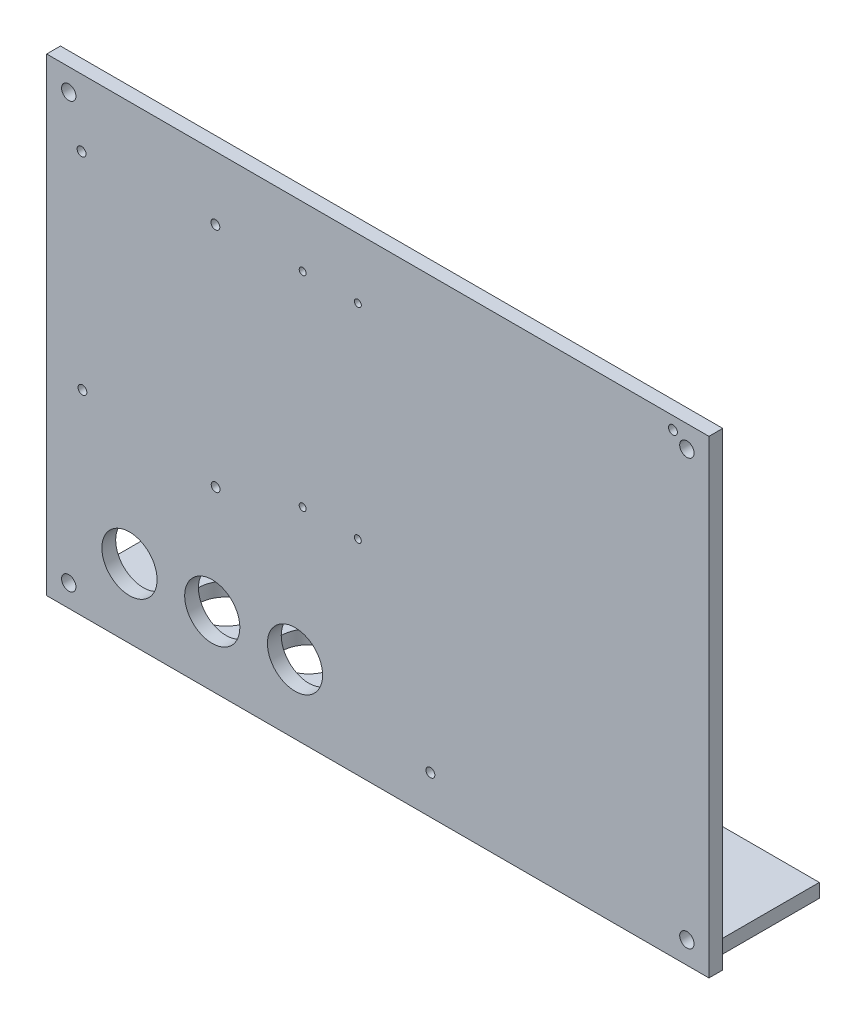
ISO-10303-21;
HEADER;
FILE_DESCRIPTION(('STEP AP214'),'2;1');
FILE_NAME('part.step','',(''),(''),'','','');
FILE_SCHEMA(('AUTOMOTIVE_DESIGN { 1 0 10303 214 1 1 1 1 }'));
ENDSEC;
DATA;
#1=APPLICATION_CONTEXT('core data for automotive mechanical design processes');
#2=APPLICATION_PROTOCOL_DEFINITION('international standard','automotive_design',2000,#1);
#3=PRODUCT_CONTEXT('',#1,'mechanical');
#4=PRODUCT('Part','Part','',(#3));
#5=PRODUCT_RELATED_PRODUCT_CATEGORY('part','',(#4));
#6=PRODUCT_DEFINITION_FORMATION('','',#4);
#7=PRODUCT_DEFINITION_CONTEXT('part definition',#1,'design');
#8=PRODUCT_DEFINITION('design','',#6,#7);
#9=PRODUCT_DEFINITION_SHAPE('','',#8);
#10=(LENGTH_UNIT() NAMED_UNIT(*) SI_UNIT(.MILLI.,.METRE.));
#11=(NAMED_UNIT(*) PLANE_ANGLE_UNIT() SI_UNIT($,.RADIAN.));
#12=(NAMED_UNIT(*) SI_UNIT($,.STERADIAN.) SOLID_ANGLE_UNIT());
#13=UNCERTAINTY_MEASURE_WITH_UNIT(LENGTH_MEASURE(1.E-05),#10,'distance_accuracy_value','');
#14=(GEOMETRIC_REPRESENTATION_CONTEXT(3) GLOBAL_UNCERTAINTY_ASSIGNED_CONTEXT((#13)) GLOBAL_UNIT_ASSIGNED_CONTEXT((#10,
#11,#12)) REPRESENTATION_CONTEXT('',''));
#15=CARTESIAN_POINT('',(0.,0.,0.));
#16=DIRECTION('',(0.,0.,1.));
#17=DIRECTION('',(1.,0.,0.));
#18=AXIS2_PLACEMENT_3D('',#15,#16,#17);
#19=CARTESIAN_POINT('',(0.,0.,0.));
#20=DIRECTION('',(0.,0.,1.));
#21=DIRECTION('',(1.,0.,0.));
#22=AXIS2_PLACEMENT_3D('',#19,#20,#21);
#23=PLANE('',#22);
#24=CARTESIAN_POINT('',(-51.7649411553885,-136.154688976129,0.));
#25=DIRECTION('',(0.,0.,-1.));
#26=DIRECTION('',(-1.,0.,0.));
#27=AXIS2_PLACEMENT_3D('',#24,#25,#26);
#28=CIRCLE('',#27,10.);
#29=CARTESIAN_POINT('',(-61.7649411553885,-136.154688976129,0.));
#30=VERTEX_POINT('',#29);
#31=EDGE_CURVE('E250',#30,#30,#28,.T.);
#32=ORIENTED_EDGE('',*,*,#31,.F.);
#33=EDGE_LOOP('',(#32));
#34=FACE_BOUND('',#33,.T.);
#35=CARTESIAN_POINT('',(-21.7649411553885,-136.154688976129,0.));
#36=DIRECTION('',(0.,0.,-1.));
#37=DIRECTION('',(-1.,0.,0.));
#38=AXIS2_PLACEMENT_3D('',#35,#36,#37);
#39=CIRCLE('',#38,10.);
#40=CARTESIAN_POINT('',(-31.7649411553885,-136.154688976129,0.));
#41=VERTEX_POINT('',#40);
#42=EDGE_CURVE('E279',#41,#41,#39,.T.);
#43=ORIENTED_EDGE('',*,*,#42,.F.);
#44=EDGE_LOOP('',(#43));
#45=FACE_BOUND('',#44,.T.);
#46=CARTESIAN_POINT('',(8.23505884461147,-136.154688976129,0.));
#47=DIRECTION('',(0.,0.,-1.));
#48=DIRECTION('',(-1.,0.,0.));
#49=AXIS2_PLACEMENT_3D('',#46,#47,#48);
#50=CIRCLE('',#49,10.);
#51=CARTESIAN_POINT('',(-1.76494115538854,-136.154688976129,0.));
#52=VERTEX_POINT('',#51);
#53=EDGE_CURVE('E276',#52,#52,#50,.T.);
#54=ORIENTED_EDGE('',*,*,#53,.F.);
#55=EDGE_LOOP('',(#54));
#56=FACE_BOUND('',#55,.T.);
#57=CARTESIAN_POINT('',(31.,-13.,0.));
#58=DIRECTION('',(0.,0.,-1.));
#59=DIRECTION('',(-1.,0.,0.));
#60=AXIS2_PLACEMENT_3D('',#57,#58,#59);
#61=CIRCLE('',#60,1.25);
#62=CARTESIAN_POINT('',(29.75,-13.,0.));
#63=VERTEX_POINT('',#62);
#64=EDGE_CURVE('E185',#63,#63,#61,.T.);
#65=ORIENTED_EDGE('',*,*,#64,.F.);
#66=EDGE_LOOP('',(#65));
#67=FACE_BOUND('',#66,.T.);
#68=CARTESIAN_POINT('',(11.,-13.,0.));
#69=DIRECTION('',(0.,0.,-1.));
#70=DIRECTION('',(-1.,0.,0.));
#71=AXIS2_PLACEMENT_3D('',#68,#69,#70);
#72=CIRCLE('',#71,1.25);
#73=CARTESIAN_POINT('',(9.74999999999997,-13.,0.));
#74=VERTEX_POINT('',#73);
#75=EDGE_CURVE('E175',#74,#74,#72,.T.);
#76=ORIENTED_EDGE('',*,*,#75,.F.);
#77=EDGE_LOOP('',(#76));
#78=FACE_BOUND('',#77,.T.);
#79=CARTESIAN_POINT('',(-20.6326854639864,-14.1546889761291,0.));
#80=DIRECTION('',(0.,0.,-1.));
#81=DIRECTION('',(-1.,0.,0.));
#82=AXIS2_PLACEMENT_3D('',#79,#80,#81);
#83=CIRCLE('',#82,1.60782040640002);
#84=CARTESIAN_POINT('',(-22.2405058703864,-14.1546889761291,0.));
#85=VERTEX_POINT('',#84);
#86=EDGE_CURVE('E168',#85,#85,#83,.T.);
#87=ORIENTED_EDGE('',*,*,#86,.F.);
#88=EDGE_LOOP('',(#87));
#89=FACE_BOUND('',#88,.T.);
#90=CARTESIAN_POINT('',(-69.1286654639864,-15.4308989761291,0.));
#91=DIRECTION('',(0.,0.,-1.));
#92=DIRECTION('',(-1.,0.,0.));
#93=AXIS2_PLACEMENT_3D('',#90,#91,#92);
#94=CIRCLE('',#93,1.60782040640001);
#95=CARTESIAN_POINT('',(-70.7364858703864,-15.4308989761291,0.));
#96=VERTEX_POINT('',#95);
#97=EDGE_CURVE('E189',#96,#96,#94,.T.);
#98=ORIENTED_EDGE('',*,*,#97,.F.);
#99=EDGE_LOOP('',(#98));
#100=FACE_BOUND('',#99,.T.);
#101=CARTESIAN_POINT('',(145.2,4.34531102387048,0.));
#102=DIRECTION('',(0.,0.,-1.));
#103=DIRECTION('',(-1.,0.,0.));
#104=AXIS2_PLACEMENT_3D('',#101,#102,#103);
#105=CIRCLE('',#104,1.59999999999999);
#106=CARTESIAN_POINT('',(143.6,4.34531102387048,0.));
#107=VERTEX_POINT('',#106);
#108=EDGE_CURVE('E182',#107,#107,#105,.T.);
#109=ORIENTED_EDGE('',*,*,#108,.F.);
#110=EDGE_LOOP('',(#109));
#111=FACE_BOUND('',#110,.T.);
#112=CARTESIAN_POINT('',(-68.7987367729394,-90.1157562725625,0.));
#113=DIRECTION('',(0.,0.,-1.));
#114=DIRECTION('',(-1.,0.,0.));
#115=AXIS2_PLACEMENT_3D('',#112,#113,#114);
#116=CIRCLE('',#115,1.59999680000002);
#117=CARTESIAN_POINT('',(-70.3987335729394,-90.1157562725625,0.));
#118=VERTEX_POINT('',#117);
#119=EDGE_CURVE('E181',#118,#118,#116,.T.);
#120=ORIENTED_EDGE('',*,*,#119,.F.);
#121=EDGE_LOOP('',(#120));
#122=FACE_BOUND('',#121,.T.);
#123=CARTESIAN_POINT('',(-20.5387367729394,-96.4657562725625,0.));
#124=DIRECTION('',(0.,0.,-1.));
#125=DIRECTION('',(-1.,0.,0.));
#126=AXIS2_PLACEMENT_3D('',#123,#124,#125);
#127=CIRCLE('',#126,1.5999968);
#128=CARTESIAN_POINT('',(-22.1387335729394,-96.4657562725625,0.));
#129=VERTEX_POINT('',#128);
#130=EDGE_CURVE('E199',#129,#129,#127,.T.);
#131=ORIENTED_EDGE('',*,*,#130,.F.);
#132=EDGE_LOOP('',(#131));
#133=FACE_BOUND('',#132,.T.);
#134=CARTESIAN_POINT('',(31.,-87.,0.));
#135=DIRECTION('',(0.,0.,-1.));
#136=DIRECTION('',(-1.,0.,0.));
#137=AXIS2_PLACEMENT_3D('',#134,#135,#136);
#138=CIRCLE('',#137,1.25);
#139=CARTESIAN_POINT('',(29.75,-87.,0.));
#140=VERTEX_POINT('',#139);
#141=EDGE_CURVE('E205',#140,#140,#138,.T.);
#142=ORIENTED_EDGE('',*,*,#141,.F.);
#143=EDGE_LOOP('',(#142));
#144=FACE_BOUND('',#143,.T.);
#145=CARTESIAN_POINT('',(11.,-87.,0.));
#146=DIRECTION('',(0.,0.,-1.));
#147=DIRECTION('',(-1.,0.,0.));
#148=AXIS2_PLACEMENT_3D('',#145,#146,#147);
#149=CIRCLE('',#148,1.25);
#150=CARTESIAN_POINT('',(9.74999999999996,-87.,0.));
#151=VERTEX_POINT('',#150);
#152=EDGE_CURVE('E211',#151,#151,#149,.T.);
#153=ORIENTED_EDGE('',*,*,#152,.F.);
#154=EDGE_LOOP('',(#153));
#155=FACE_BOUND('',#154,.T.);
#156=CARTESIAN_POINT('',(57.3000000000001,-147.15468897613,0.));
#157=DIRECTION('',(0.,0.,1.));
#158=DIRECTION('',(1.,0.,0.));
#159=AXIS2_PLACEMENT_3D('',#156,#157,#158);
#160=CIRCLE('',#159,1.59999999999999);
#161=CARTESIAN_POINT('',(58.9000000000001,-147.15468897613,0.));
#162=VERTEX_POINT('',#161);
#163=EDGE_CURVE('E162',#162,#162,#160,.T.);
#164=ORIENTED_EDGE('',*,*,#163,.T.);
#165=EDGE_LOOP('',(#164));
#166=FACE_BOUND('',#165,.T.);
#167=CARTESIAN_POINT('',(-73.7649411553885,-153.154688976129,0.));
#168=DIRECTION('',(0.,0.,-1.));
#169=DIRECTION('',(-1.,0.,0.));
#170=AXIS2_PLACEMENT_3D('',#167,#168,#169);
#171=CIRCLE('',#170,2.6);
#172=CARTESIAN_POINT('',(-76.3649411553885,-153.154688976129,0.));
#173=VERTEX_POINT('',#172);
#174=EDGE_CURVE('E141',#173,#173,#171,.T.);
#175=ORIENTED_EDGE('',*,*,#174,.F.);
#176=EDGE_LOOP('',(#175));
#177=FACE_BOUND('',#176,.T.);
#178=CARTESIAN_POINT('',(150.235058844612,-153.154688976129,0.));
#179=DIRECTION('',(0.,0.,-1.));
#180=DIRECTION('',(-1.,0.,0.));
#181=AXIS2_PLACEMENT_3D('',#178,#179,#180);
#182=CIRCLE('',#181,2.59999999999999);
#183=CARTESIAN_POINT('',(147.635058844612,-153.154688976129,0.));
#184=VERTEX_POINT('',#183);
#185=EDGE_CURVE('E142',#184,#184,#182,.T.);
#186=ORIENTED_EDGE('',*,*,#185,.F.);
#187=EDGE_LOOP('',(#186));
#188=FACE_BOUND('',#187,.T.);
#189=CARTESIAN_POINT('',(150.235058844612,0.84531102387056,0.));
#190=DIRECTION('',(0.,0.,-1.));
#191=DIRECTION('',(-1.,0.,0.));
#192=AXIS2_PLACEMENT_3D('',#189,#190,#191);
#193=CIRCLE('',#192,2.59999999999999);
#194=CARTESIAN_POINT('',(147.635058844612,0.84531102387056,0.));
#195=VERTEX_POINT('',#194);
#196=EDGE_CURVE('E148',#195,#195,#193,.T.);
#197=ORIENTED_EDGE('',*,*,#196,.F.);
#198=EDGE_LOOP('',(#197));
#199=FACE_BOUND('',#198,.T.);
#200=CARTESIAN_POINT('',(-73.7649411553885,0.845311023870549,0.));
#201=DIRECTION('',(0.,0.,-1.));
#202=DIRECTION('',(-1.,0.,0.));
#203=AXIS2_PLACEMENT_3D('',#200,#201,#202);
#204=CIRCLE('',#203,2.6);
#205=CARTESIAN_POINT('',(-76.3649411553885,0.845311023870549,0.));
#206=VERTEX_POINT('',#205);
#207=EDGE_CURVE('E132',#206,#206,#204,.T.);
#208=ORIENTED_EDGE('',*,*,#207,.F.);
#209=EDGE_LOOP('',(#208));
#210=FACE_BOUND('',#209,.T.);
#211=DIRECTION('',(0.,-1.,0.));
#212=VECTOR('',#211,1.);
#213=CARTESIAN_POINT('',(153.235058844612,-161.154688976129,0.));
#214=LINE('',#213,#212);
#215=CARTESIAN_POINT('',(153.235058844612,-156.154688976129,0.));
#216=VERTEX_POINT('',#215);
#217=CARTESIAN_POINT('',(153.235058844611,-161.154688976129,0.));
#218=VERTEX_POINT('',#217);
#219=EDGE_CURVE('E53',#216,#218,#214,.T.);
#220=ORIENTED_EDGE('',*,*,#219,.F.);
#221=DIRECTION('',(1.,0.,0.));
#222=VECTOR('',#221,1.);
#223=CARTESIAN_POINT('',(153.235058844612,-156.154688976129,0.));
#224=LINE('',#223,#222);
#225=CARTESIAN_POINT('',(-76.7649411553885,-156.154688976129,0.));
#226=VERTEX_POINT('',#225);
#227=EDGE_CURVE('E100',#226,#216,#224,.T.);
#228=ORIENTED_EDGE('',*,*,#227,.F.);
#229=DIRECTION('',(0.,1.,0.));
#230=VECTOR('',#229,1.);
#231=CARTESIAN_POINT('',(-76.7649411553885,-161.154688976129,0.));
#232=LINE('',#231,#230);
#233=CARTESIAN_POINT('',(-76.7649411553885,-161.154688976129,0.));
#234=VERTEX_POINT('',#233);
#235=EDGE_CURVE('E103',#234,#226,#232,.T.);
#236=ORIENTED_EDGE('',*,*,#235,.F.);
#237=DIRECTION('',(1.,0.,0.));
#238=VECTOR('',#237,1.);
#239=CARTESIAN_POINT('',(-81.7649411553885,-161.154688976129,0.));
#240=LINE('',#239,#238);
#241=CARTESIAN_POINT('',(-81.7649411553885,-161.154688976129,0.));
#242=VERTEX_POINT('',#241);
#243=EDGE_CURVE('E235',#242,#234,#240,.T.);
#244=ORIENTED_EDGE('',*,*,#243,.F.);
#245=DIRECTION('',(0.,-1.,0.));
#246=VECTOR('',#245,1.);
#247=CARTESIAN_POINT('',(-81.7649411553885,8.84531102387055,0.));
#248=LINE('',#247,#246);
#249=CARTESIAN_POINT('',(-81.7649411553885,8.84531102387055,0.));
#250=VERTEX_POINT('',#249);
#251=EDGE_CURVE('E219',#250,#242,#248,.T.);
#252=ORIENTED_EDGE('',*,*,#251,.F.);
#253=DIRECTION('',(-1.,0.,0.));
#254=VECTOR('',#253,1.);
#255=CARTESIAN_POINT('',(-81.7649411553885,8.84531102387055,0.));
#256=LINE('',#255,#254);
#257=CARTESIAN_POINT('',(158.235058844611,8.84531102387055,0.));
#258=VERTEX_POINT('',#257);
#259=EDGE_CURVE('E226',#258,#250,#256,.T.);
#260=ORIENTED_EDGE('',*,*,#259,.F.);
#261=DIRECTION('',(0.,1.,0.));
#262=VECTOR('',#261,1.);
#263=CARTESIAN_POINT('',(158.235058844611,8.84531102387055,0.));
#264=LINE('',#263,#262);
#265=CARTESIAN_POINT('',(158.235058844612,-161.154688976129,0.));
#266=VERTEX_POINT('',#265);
#267=EDGE_CURVE('E237',#266,#258,#264,.T.);
#268=ORIENTED_EDGE('',*,*,#267,.F.);
#269=EDGE_CURVE('E58',#218,#266,#240,.T.);
#270=ORIENTED_EDGE('',*,*,#269,.F.);
#271=EDGE_LOOP('',(#220,#228,#236,#244,#252,#260,#268,#270));
#272=FACE_BOUND('',#271,.T.);
#273=ADVANCED_FACE('F36',(#34,#45,#56,#67,#78,#89,#100,#111,#122,#133,#144,#155,#166,#177,#188,
#199,#210,#272),#23,.F.);
#274=CARTESIAN_POINT('',(-81.7649411553885,8.84531102387055,5.));
#275=DIRECTION('',(1.,0.,0.));
#276=DIRECTION('',(0.,1.,0.));
#277=AXIS2_PLACEMENT_3D('',#274,#275,#276);
#278=PLANE('',#277);
#279=ORIENTED_EDGE('',*,*,#251,.T.);
#280=DIRECTION('',(0.,0.,-1.));
#281=VECTOR('',#280,1.);
#282=CARTESIAN_POINT('',(-81.7649411553885,-161.154688976129,5.));
#283=LINE('',#282,#281);
#284=CARTESIAN_POINT('',(-81.7649411553885,-161.154688976129,5.));
#285=VERTEX_POINT('',#284);
#286=EDGE_CURVE('E12',#285,#242,#283,.T.);
#287=ORIENTED_EDGE('',*,*,#286,.F.);
#288=DIRECTION('',(0.,-1.,0.));
#289=VECTOR('',#288,1.);
#290=CARTESIAN_POINT('',(-81.7649411553885,8.84531102387055,5.));
#291=LINE('',#290,#289);
#292=CARTESIAN_POINT('',(-81.7649411553885,8.84531102387055,5.));
#293=VERTEX_POINT('',#292);
#294=EDGE_CURVE('E222',#293,#285,#291,.T.);
#295=ORIENTED_EDGE('',*,*,#294,.F.);
#296=DIRECTION('',(0.,0.,-1.));
#297=VECTOR('',#296,1.);
#298=CARTESIAN_POINT('',(-81.7649411553885,8.84531102387055,5.));
#299=LINE('',#298,#297);
#300=EDGE_CURVE('E232',#293,#250,#299,.T.);
#301=ORIENTED_EDGE('',*,*,#300,.T.);
#302=EDGE_LOOP('',(#279,#287,#295,#301));
#303=FACE_BOUND('',#302,.T.);
#304=ADVANCED_FACE('F38',(#303),#278,.F.);
#305=CARTESIAN_POINT('',(-81.7649411553885,-161.154688976129,5.));
#306=DIRECTION('',(0.,1.,0.));
#307=DIRECTION('',(0.,0.,1.));
#308=AXIS2_PLACEMENT_3D('',#305,#306,#307);
#309=PLANE('',#308);
#310=CARTESIAN_POINT('',(-41.7649411553884,-161.154688976129,-20.));
#311=DIRECTION('',(0.,-1.,0.));
#312=DIRECTION('',(0.,0.,-1.));
#313=AXIS2_PLACEMENT_3D('',#310,#311,#312);
#314=CIRCLE('',#313,10.);
#315=CARTESIAN_POINT('',(-41.7649411553884,-161.154688976129,-30.));
#316=VERTEX_POINT('',#315);
#317=EDGE_CURVE('E271',#316,#316,#314,.T.);
#318=ORIENTED_EDGE('',*,*,#317,.F.);
#319=EDGE_LOOP('',(#318));
#320=FACE_BOUND('',#319,.T.);
#321=CARTESIAN_POINT('',(-11.7649411553885,-161.154688976129,-20.));
#322=DIRECTION('',(0.,-1.,0.));
#323=DIRECTION('',(0.,0.,-1.));
#324=AXIS2_PLACEMENT_3D('',#321,#322,#323);
#325=CIRCLE('',#324,10.);
#326=CARTESIAN_POINT('',(-11.7649411553885,-161.154688976129,-30.));
#327=VERTEX_POINT('',#326);
#328=EDGE_CURVE('E263',#327,#327,#325,.T.);
#329=ORIENTED_EDGE('',*,*,#328,.F.);
#330=EDGE_LOOP('',(#329));
#331=FACE_BOUND('',#330,.T.);
#332=CARTESIAN_POINT('',(18.2350588446115,-161.154688976129,-20.));
#333=DIRECTION('',(0.,-1.,0.));
#334=DIRECTION('',(0.,0.,-1.));
#335=AXIS2_PLACEMENT_3D('',#332,#333,#334);
#336=CIRCLE('',#335,10.);
#337=CARTESIAN_POINT('',(18.2350588446115,-161.154688976129,-30.));
#338=VERTEX_POINT('',#337);
#339=EDGE_CURVE('E255',#338,#338,#336,.T.);
#340=ORIENTED_EDGE('',*,*,#339,.F.);
#341=EDGE_LOOP('',(#340));
#342=FACE_BOUND('',#341,.T.);
#343=ORIENTED_EDGE('',*,*,#243,.T.);
#344=DIRECTION('',(0.,0.,1.));
#345=VECTOR('',#344,1.);
#346=CARTESIAN_POINT('',(-76.7649411553885,-161.154688976129,-270.054341406547));
#347=LINE('',#346,#345);
#348=CARTESIAN_POINT('',(-76.7649411553885,-161.15468897613,-40.));
#349=VERTEX_POINT('',#348);
#350=EDGE_CURVE('E116',#349,#234,#347,.T.);
#351=ORIENTED_EDGE('',*,*,#350,.F.);
#352=DIRECTION('',(-1.,0.,0.));
#353=VECTOR('',#352,1.);
#354=CARTESIAN_POINT('',(153.235058844612,-161.154688976129,-40.));
#355=LINE('',#354,#353);
#356=CARTESIAN_POINT('',(153.235058844612,-161.15468897613,-40.));
#357=VERTEX_POINT('',#356);
#358=EDGE_CURVE('E135',#357,#349,#355,.T.);
#359=ORIENTED_EDGE('',*,*,#358,.F.);
#360=DIRECTION('',(0.,0.,1.));
#361=VECTOR('',#360,1.);
#362=CARTESIAN_POINT('',(153.235058844612,-161.154688976129,-270.054341406547));
#363=LINE('',#362,#361);
#364=EDGE_CURVE('E128',#357,#218,#363,.T.);
#365=ORIENTED_EDGE('',*,*,#364,.T.);
#366=ORIENTED_EDGE('',*,*,#269,.T.);
#367=DIRECTION('',(0.,0.,-1.));
#368=VECTOR('',#367,1.);
#369=CARTESIAN_POINT('',(158.235058844612,-161.154688976129,5.));
#370=LINE('',#369,#368);
#371=CARTESIAN_POINT('',(158.235058844612,-161.154688976129,5.));
#372=VERTEX_POINT('',#371);
#373=EDGE_CURVE('E45',#372,#266,#370,.T.);
#374=ORIENTED_EDGE('',*,*,#373,.F.);
#375=DIRECTION('',(1.,0.,0.));
#376=VECTOR('',#375,1.);
#377=CARTESIAN_POINT('',(-81.7649411553885,-161.154688976129,5.));
#378=LINE('',#377,#376);
#379=EDGE_CURVE('E225',#285,#372,#378,.T.);
#380=ORIENTED_EDGE('',*,*,#379,.F.);
#381=ORIENTED_EDGE('',*,*,#286,.T.);
#382=EDGE_LOOP('',(#343,#351,#359,#365,#366,#374,#380,#381));
#383=FACE_BOUND('',#382,.T.);
#384=ADVANCED_FACE('F395',(#320,#331,#342,#383),#309,.F.);
#385=CARTESIAN_POINT('',(158.235058844611,8.84531102387055,5.));
#386=DIRECTION('',(-1.,0.,0.));
#387=DIRECTION('',(0.,-1.,0.));
#388=AXIS2_PLACEMENT_3D('',#385,#386,#387);
#389=PLANE('',#388);
#390=ORIENTED_EDGE('',*,*,#267,.T.);
#391=DIRECTION('',(0.,0.,-1.));
#392=VECTOR('',#391,1.);
#393=CARTESIAN_POINT('',(158.235058844611,8.84531102387055,5.));
#394=LINE('',#393,#392);
#395=CARTESIAN_POINT('',(158.235058844611,8.84531102387055,5.));
#396=VERTEX_POINT('',#395);
#397=EDGE_CURVE('E242',#396,#258,#394,.T.);
#398=ORIENTED_EDGE('',*,*,#397,.F.);
#399=DIRECTION('',(0.,1.,0.));
#400=VECTOR('',#399,1.);
#401=CARTESIAN_POINT('',(158.235058844611,8.84531102387055,5.));
#402=LINE('',#401,#400);
#403=EDGE_CURVE('E228',#372,#396,#402,.T.);
#404=ORIENTED_EDGE('',*,*,#403,.F.);
#405=ORIENTED_EDGE('',*,*,#373,.T.);
#406=EDGE_LOOP('',(#390,#398,#404,#405));
#407=FACE_BOUND('',#406,.T.);
#408=ADVANCED_FACE('F392',(#407),#389,.F.);
#409=CARTESIAN_POINT('',(-81.7649411553885,8.84531102387055,5.));
#410=DIRECTION('',(0.,-1.,0.));
#411=DIRECTION('',(0.,0.,-1.));
#412=AXIS2_PLACEMENT_3D('',#409,#410,#411);
#413=PLANE('',#412);
#414=ORIENTED_EDGE('',*,*,#259,.T.);
#415=ORIENTED_EDGE('',*,*,#300,.F.);
#416=DIRECTION('',(-1.,0.,0.));
#417=VECTOR('',#416,1.);
#418=CARTESIAN_POINT('',(-81.7649411553885,8.84531102387055,5.));
#419=LINE('',#418,#417);
#420=EDGE_CURVE('E230',#396,#293,#419,.T.);
#421=ORIENTED_EDGE('',*,*,#420,.F.);
#422=ORIENTED_EDGE('',*,*,#397,.T.);
#423=EDGE_LOOP('',(#414,#415,#421,#422));
#424=FACE_BOUND('',#423,.T.);
#425=ADVANCED_FACE('F387',(#424),#413,.F.);
#426=CARTESIAN_POINT('',(0.,0.,5.));
#427=DIRECTION('',(0.,0.,1.));
#428=DIRECTION('',(1.,0.,0.));
#429=AXIS2_PLACEMENT_3D('',#426,#427,#428);
#430=PLANE('',#429);
#431=CARTESIAN_POINT('',(-51.7649411553885,-136.154688976129,5.));
#432=DIRECTION('',(0.,0.,1.));
#433=DIRECTION('',(1.,0.,0.));
#434=AXIS2_PLACEMENT_3D('',#431,#432,#433);
#435=CIRCLE('',#434,10.);
#436=CARTESIAN_POINT('',(-41.7649411553885,-136.154688976129,5.));
#437=VERTEX_POINT('',#436);
#438=EDGE_CURVE('E40',#437,#437,#435,.T.);
#439=ORIENTED_EDGE('',*,*,#438,.F.);
#440=EDGE_LOOP('',(#439));
#441=FACE_BOUND('',#440,.T.);
#442=CARTESIAN_POINT('',(-21.7649411553885,-136.154688976129,5.));
#443=DIRECTION('',(0.,0.,1.));
#444=DIRECTION('',(1.,0.,0.));
#445=AXIS2_PLACEMENT_3D('',#442,#443,#444);
#446=CIRCLE('',#445,10.);
#447=CARTESIAN_POINT('',(-11.7649411553885,-136.154688976129,5.));
#448=VERTEX_POINT('',#447);
#449=EDGE_CURVE('E249',#448,#448,#446,.T.);
#450=ORIENTED_EDGE('',*,*,#449,.F.);
#451=EDGE_LOOP('',(#450));
#452=FACE_BOUND('',#451,.T.);
#453=CARTESIAN_POINT('',(8.23505884461147,-136.154688976129,5.));
#454=DIRECTION('',(0.,0.,1.));
#455=DIRECTION('',(1.,0.,0.));
#456=AXIS2_PLACEMENT_3D('',#453,#454,#455);
#457=CIRCLE('',#456,10.);
#458=CARTESIAN_POINT('',(18.2350588446115,-136.154688976129,5.));
#459=VERTEX_POINT('',#458);
#460=EDGE_CURVE('E247',#459,#459,#457,.T.);
#461=ORIENTED_EDGE('',*,*,#460,.F.);
#462=EDGE_LOOP('',(#461));
#463=FACE_BOUND('',#462,.T.);
#464=CARTESIAN_POINT('',(-73.7649411553885,0.845311023870549,5.));
#465=DIRECTION('',(0.,0.,-1.));
#466=DIRECTION('',(-1.,0.,0.));
#467=AXIS2_PLACEMENT_3D('',#464,#465,#466);
#468=CIRCLE('',#467,2.6);
#469=CARTESIAN_POINT('',(-76.3649411553885,0.845311023870549,5.));
#470=VERTEX_POINT('',#469);
#471=EDGE_CURVE('E151',#470,#470,#468,.T.);
#472=ORIENTED_EDGE('',*,*,#471,.T.);
#473=EDGE_LOOP('',(#472));
#474=FACE_BOUND('',#473,.T.);
#475=CARTESIAN_POINT('',(150.235058844612,0.84531102387056,5.));
#476=DIRECTION('',(0.,0.,-1.));
#477=DIRECTION('',(-1.,0.,0.));
#478=AXIS2_PLACEMENT_3D('',#475,#476,#477);
#479=CIRCLE('',#478,2.59999999999999);
#480=CARTESIAN_POINT('',(147.635058844612,0.84531102387056,5.));
#481=VERTEX_POINT('',#480);
#482=EDGE_CURVE('E145',#481,#481,#479,.T.);
#483=ORIENTED_EDGE('',*,*,#482,.T.);
#484=EDGE_LOOP('',(#483));
#485=FACE_BOUND('',#484,.T.);
#486=CARTESIAN_POINT('',(150.235058844612,-153.154688976129,5.));
#487=DIRECTION('',(0.,0.,-1.));
#488=DIRECTION('',(-1.,0.,0.));
#489=AXIS2_PLACEMENT_3D('',#486,#487,#488);
#490=CIRCLE('',#489,2.59999999999999);
#491=CARTESIAN_POINT('',(147.635058844612,-153.154688976129,5.));
#492=VERTEX_POINT('',#491);
#493=EDGE_CURVE('E138',#492,#492,#490,.T.);
#494=ORIENTED_EDGE('',*,*,#493,.T.);
#495=EDGE_LOOP('',(#494));
#496=FACE_BOUND('',#495,.T.);
#497=CARTESIAN_POINT('',(-73.7649411553885,-153.154688976129,5.));
#498=DIRECTION('',(0.,0.,-1.));
#499=DIRECTION('',(-1.,0.,0.));
#500=AXIS2_PLACEMENT_3D('',#497,#498,#499);
#501=CIRCLE('',#500,2.6);
#502=CARTESIAN_POINT('',(-76.3649411553885,-153.154688976129,5.));
#503=VERTEX_POINT('',#502);
#504=EDGE_CURVE('E156',#503,#503,#501,.T.);
#505=ORIENTED_EDGE('',*,*,#504,.T.);
#506=EDGE_LOOP('',(#505));
#507=FACE_BOUND('',#506,.T.);
#508=CARTESIAN_POINT('',(57.3000000000001,-147.15468897613,5.));
#509=DIRECTION('',(0.,0.,1.));
#510=DIRECTION('',(1.,0.,0.));
#511=AXIS2_PLACEMENT_3D('',#508,#509,#510);
#512=CIRCLE('',#511,1.59999999999999);
#513=CARTESIAN_POINT('',(58.9000000000001,-147.15468897613,5.));
#514=VERTEX_POINT('',#513);
#515=EDGE_CURVE('E159',#514,#514,#512,.T.);
#516=ORIENTED_EDGE('',*,*,#515,.F.);
#517=EDGE_LOOP('',(#516));
#518=FACE_BOUND('',#517,.T.);
#519=CARTESIAN_POINT('',(11.,-87.,5.));
#520=DIRECTION('',(0.,0.,-1.));
#521=DIRECTION('',(-1.,0.,0.));
#522=AXIS2_PLACEMENT_3D('',#519,#520,#521);
#523=CIRCLE('',#522,1.25);
#524=CARTESIAN_POINT('',(9.74999999999996,-87.,5.));
#525=VERTEX_POINT('',#524);
#526=EDGE_CURVE('E165',#525,#525,#523,.T.);
#527=ORIENTED_EDGE('',*,*,#526,.T.);
#528=EDGE_LOOP('',(#527));
#529=FACE_BOUND('',#528,.T.);
#530=CARTESIAN_POINT('',(31.,-87.,5.));
#531=DIRECTION('',(0.,0.,-1.));
#532=DIRECTION('',(-1.,0.,0.));
#533=AXIS2_PLACEMENT_3D('',#530,#531,#532);
#534=CIRCLE('',#533,1.25);
#535=CARTESIAN_POINT('',(29.75,-87.,5.));
#536=VERTEX_POINT('',#535);
#537=EDGE_CURVE('E208',#536,#536,#534,.T.);
#538=ORIENTED_EDGE('',*,*,#537,.T.);
#539=EDGE_LOOP('',(#538));
#540=FACE_BOUND('',#539,.T.);
#541=CARTESIAN_POINT('',(-20.5387367729394,-96.4657562725625,5.));
#542=DIRECTION('',(0.,0.,-1.));
#543=DIRECTION('',(-1.,0.,0.));
#544=AXIS2_PLACEMENT_3D('',#541,#542,#543);
#545=CIRCLE('',#544,1.5999968);
#546=CARTESIAN_POINT('',(-22.1387335729394,-96.4657562725625,5.));
#547=VERTEX_POINT('',#546);
#548=EDGE_CURVE('E202',#547,#547,#545,.T.);
#549=ORIENTED_EDGE('',*,*,#548,.T.);
#550=EDGE_LOOP('',(#549));
#551=FACE_BOUND('',#550,.T.);
#552=CARTESIAN_POINT('',(-68.7987367729394,-90.1157562725625,5.));
#553=DIRECTION('',(0.,0.,-1.));
#554=DIRECTION('',(-1.,0.,0.));
#555=AXIS2_PLACEMENT_3D('',#552,#553,#554);
#556=CIRCLE('',#555,1.59999680000002);
#557=CARTESIAN_POINT('',(-70.3987335729394,-90.1157562725625,5.));
#558=VERTEX_POINT('',#557);
#559=EDGE_CURVE('E196',#558,#558,#556,.T.);
#560=ORIENTED_EDGE('',*,*,#559,.T.);
#561=EDGE_LOOP('',(#560));
#562=FACE_BOUND('',#561,.T.);
#563=CARTESIAN_POINT('',(145.2,4.34531102387048,5.));
#564=DIRECTION('',(0.,0.,-1.));
#565=DIRECTION('',(-1.,0.,0.));
#566=AXIS2_PLACEMENT_3D('',#563,#564,#565);
#567=CIRCLE('',#566,1.59999999999999);
#568=CARTESIAN_POINT('',(143.6,4.34531102387048,5.));
#569=VERTEX_POINT('',#568);
#570=EDGE_CURVE('E186',#569,#569,#567,.T.);
#571=ORIENTED_EDGE('',*,*,#570,.T.);
#572=EDGE_LOOP('',(#571));
#573=FACE_BOUND('',#572,.T.);
#574=CARTESIAN_POINT('',(-69.1286654639864,-15.4308989761291,5.));
#575=DIRECTION('',(0.,0.,-1.));
#576=DIRECTION('',(-1.,0.,0.));
#577=AXIS2_PLACEMENT_3D('',#574,#575,#576);
#578=CIRCLE('',#577,1.60782040640001);
#579=CARTESIAN_POINT('',(-70.7364858703864,-15.4308989761291,5.));
#580=VERTEX_POINT('',#579);
#581=EDGE_CURVE('E171',#580,#580,#578,.T.);
#582=ORIENTED_EDGE('',*,*,#581,.T.);
#583=EDGE_LOOP('',(#582));
#584=FACE_BOUND('',#583,.T.);
#585=CARTESIAN_POINT('',(-20.6326854639864,-14.1546889761291,5.));
#586=DIRECTION('',(0.,0.,-1.));
#587=DIRECTION('',(-1.,0.,0.));
#588=AXIS2_PLACEMENT_3D('',#585,#586,#587);
#589=CIRCLE('',#588,1.60782040640002);
#590=CARTESIAN_POINT('',(-22.2405058703864,-14.1546889761291,5.));
#591=VERTEX_POINT('',#590);
#592=EDGE_CURVE('E172',#591,#591,#589,.T.);
#593=ORIENTED_EDGE('',*,*,#592,.T.);
#594=EDGE_LOOP('',(#593));
#595=FACE_BOUND('',#594,.T.);
#596=CARTESIAN_POINT('',(11.,-13.,5.));
#597=DIRECTION('',(0.,0.,-1.));
#598=DIRECTION('',(-1.,0.,0.));
#599=AXIS2_PLACEMENT_3D('',#596,#597,#598);
#600=CIRCLE('',#599,1.25);
#601=CARTESIAN_POINT('',(9.74999999999997,-13.,5.));
#602=VERTEX_POINT('',#601);
#603=EDGE_CURVE('E178',#602,#602,#600,.T.);
#604=ORIENTED_EDGE('',*,*,#603,.T.);
#605=EDGE_LOOP('',(#604));
#606=FACE_BOUND('',#605,.T.);
#607=CARTESIAN_POINT('',(31.,-13.,5.));
#608=DIRECTION('',(0.,0.,-1.));
#609=DIRECTION('',(-1.,0.,0.));
#610=AXIS2_PLACEMENT_3D('',#607,#608,#609);
#611=CIRCLE('',#610,1.25);
#612=CARTESIAN_POINT('',(29.75,-13.,5.));
#613=VERTEX_POINT('',#612);
#614=EDGE_CURVE('E216',#613,#613,#611,.T.);
#615=ORIENTED_EDGE('',*,*,#614,.T.);
#616=EDGE_LOOP('',(#615));
#617=FACE_BOUND('',#616,.T.);
#618=ORIENTED_EDGE('',*,*,#294,.T.);
#619=ORIENTED_EDGE('',*,*,#379,.T.);
#620=ORIENTED_EDGE('',*,*,#403,.T.);
#621=ORIENTED_EDGE('',*,*,#420,.T.);
#622=EDGE_LOOP('',(#618,#619,#620,#621));
#623=FACE_BOUND('',#622,.T.);
#624=ADVANCED_FACE('F384',(#441,#452,#463,#474,#485,#496,#507,#518,#529,#540,#551,#562,#573,
#584,#595,#606,#617,#623),#430,.T.);
#625=CARTESIAN_POINT('',(31.,-13.,5.));
#626=DIRECTION('',(0.,0.,-1.));
#627=DIRECTION('',(-1.,0.,0.));
#628=AXIS2_PLACEMENT_3D('',#625,#626,#627);
#629=CYLINDRICAL_SURFACE('',#628,1.25);
#630=ORIENTED_EDGE('',*,*,#614,.F.);
#631=EDGE_LOOP('',(#630));
#632=FACE_BOUND('',#631,.T.);
#633=ORIENTED_EDGE('',*,*,#64,.T.);
#634=EDGE_LOOP('',(#633));
#635=FACE_BOUND('',#634,.T.);
#636=ADVANCED_FACE('F358',(#632,#635),#629,.F.);
#637=CARTESIAN_POINT('',(11.,-13.,5.));
#638=DIRECTION('',(0.,0.,-1.));
#639=DIRECTION('',(-1.,0.,0.));
#640=AXIS2_PLACEMENT_3D('',#637,#638,#639);
#641=CYLINDRICAL_SURFACE('',#640,1.25);
#642=ORIENTED_EDGE('',*,*,#603,.F.);
#643=EDGE_LOOP('',(#642));
#644=FACE_BOUND('',#643,.T.);
#645=ORIENTED_EDGE('',*,*,#75,.T.);
#646=EDGE_LOOP('',(#645));
#647=FACE_BOUND('',#646,.T.);
#648=ADVANCED_FACE('F354',(#644,#647),#641,.F.);
#649=CARTESIAN_POINT('',(-20.6326854639864,-14.1546889761291,5.));
#650=DIRECTION('',(0.,0.,-1.));
#651=DIRECTION('',(-1.,0.,0.));
#652=AXIS2_PLACEMENT_3D('',#649,#650,#651);
#653=CYLINDRICAL_SURFACE('',#652,1.60782040640002);
#654=ORIENTED_EDGE('',*,*,#592,.F.);
#655=EDGE_LOOP('',(#654));
#656=FACE_BOUND('',#655,.T.);
#657=ORIENTED_EDGE('',*,*,#86,.T.);
#658=EDGE_LOOP('',(#657));
#659=FACE_BOUND('',#658,.T.);
#660=ADVANCED_FACE('F350',(#656,#659),#653,.F.);
#661=CARTESIAN_POINT('',(-69.1286654639864,-15.4308989761291,5.));
#662=DIRECTION('',(0.,0.,-1.));
#663=DIRECTION('',(-1.,0.,0.));
#664=AXIS2_PLACEMENT_3D('',#661,#662,#663);
#665=CYLINDRICAL_SURFACE('',#664,1.60782040640001);
#666=ORIENTED_EDGE('',*,*,#581,.F.);
#667=EDGE_LOOP('',(#666));
#668=FACE_BOUND('',#667,.T.);
#669=ORIENTED_EDGE('',*,*,#97,.T.);
#670=EDGE_LOOP('',(#669));
#671=FACE_BOUND('',#670,.T.);
#672=ADVANCED_FACE('F353',(#668,#671),#665,.F.);
#673=CARTESIAN_POINT('',(145.2,4.34531102387048,5.));
#674=DIRECTION('',(0.,0.,-1.));
#675=DIRECTION('',(-1.,0.,0.));
#676=AXIS2_PLACEMENT_3D('',#673,#674,#675);
#677=CYLINDRICAL_SURFACE('',#676,1.59999999999999);
#678=ORIENTED_EDGE('',*,*,#570,.F.);
#679=EDGE_LOOP('',(#678));
#680=FACE_BOUND('',#679,.T.);
#681=ORIENTED_EDGE('',*,*,#108,.T.);
#682=EDGE_LOOP('',(#681));
#683=FACE_BOUND('',#682,.T.);
#684=ADVANCED_FACE('F360',(#680,#683),#677,.F.);
#685=CARTESIAN_POINT('',(-68.7987367729394,-90.1157562725625,5.));
#686=DIRECTION('',(0.,0.,-1.));
#687=DIRECTION('',(-1.,0.,0.));
#688=AXIS2_PLACEMENT_3D('',#685,#686,#687);
#689=CYLINDRICAL_SURFACE('',#688,1.59999680000002);
#690=ORIENTED_EDGE('',*,*,#559,.F.);
#691=EDGE_LOOP('',(#690));
#692=FACE_BOUND('',#691,.T.);
#693=ORIENTED_EDGE('',*,*,#119,.T.);
#694=EDGE_LOOP('',(#693));
#695=FACE_BOUND('',#694,.T.);
#696=ADVANCED_FACE('F363',(#692,#695),#689,.F.);
#697=CARTESIAN_POINT('',(-20.5387367729394,-96.4657562725625,5.));
#698=DIRECTION('',(0.,0.,-1.));
#699=DIRECTION('',(-1.,0.,0.));
#700=AXIS2_PLACEMENT_3D('',#697,#698,#699);
#701=CYLINDRICAL_SURFACE('',#700,1.5999968);
#702=ORIENTED_EDGE('',*,*,#548,.F.);
#703=EDGE_LOOP('',(#702));
#704=FACE_BOUND('',#703,.T.);
#705=ORIENTED_EDGE('',*,*,#130,.T.);
#706=EDGE_LOOP('',(#705));
#707=FACE_BOUND('',#706,.T.);
#708=ADVANCED_FACE('F370',(#704,#707),#701,.F.);
#709=CARTESIAN_POINT('',(31.,-87.,5.));
#710=DIRECTION('',(0.,0.,-1.));
#711=DIRECTION('',(-1.,0.,0.));
#712=AXIS2_PLACEMENT_3D('',#709,#710,#711);
#713=CYLINDRICAL_SURFACE('',#712,1.25);
#714=ORIENTED_EDGE('',*,*,#537,.F.);
#715=EDGE_LOOP('',(#714));
#716=FACE_BOUND('',#715,.T.);
#717=ORIENTED_EDGE('',*,*,#141,.T.);
#718=EDGE_LOOP('',(#717));
#719=FACE_BOUND('',#718,.T.);
#720=ADVANCED_FACE('F374',(#716,#719),#713,.F.);
#721=CARTESIAN_POINT('',(11.,-87.,5.));
#722=DIRECTION('',(0.,0.,-1.));
#723=DIRECTION('',(-1.,0.,0.));
#724=AXIS2_PLACEMENT_3D('',#721,#722,#723);
#725=CYLINDRICAL_SURFACE('',#724,1.25);
#726=ORIENTED_EDGE('',*,*,#526,.F.);
#727=EDGE_LOOP('',(#726));
#728=FACE_BOUND('',#727,.T.);
#729=ORIENTED_EDGE('',*,*,#152,.T.);
#730=EDGE_LOOP('',(#729));
#731=FACE_BOUND('',#730,.T.);
#732=ADVANCED_FACE('F348',(#728,#731),#725,.F.);
#733=CARTESIAN_POINT('',(57.3000000000001,-147.15468897613,0.));
#734=DIRECTION('',(0.,0.,1.));
#735=DIRECTION('',(1.,0.,0.));
#736=AXIS2_PLACEMENT_3D('',#733,#734,#735);
#737=CYLINDRICAL_SURFACE('',#736,1.59999999999999);
#738=ORIENTED_EDGE('',*,*,#163,.F.);
#739=EDGE_LOOP('',(#738));
#740=FACE_BOUND('',#739,.T.);
#741=ORIENTED_EDGE('',*,*,#515,.T.);
#742=EDGE_LOOP('',(#741));
#743=FACE_BOUND('',#742,.T.);
#744=ADVANCED_FACE('F344',(#740,#743),#737,.F.);
#745=CARTESIAN_POINT('',(-73.7649411553885,-153.154688976129,5.));
#746=DIRECTION('',(0.,0.,-1.));
#747=DIRECTION('',(-1.,0.,0.));
#748=AXIS2_PLACEMENT_3D('',#745,#746,#747);
#749=CYLINDRICAL_SURFACE('',#748,2.6);
#750=ORIENTED_EDGE('',*,*,#504,.F.);
#751=EDGE_LOOP('',(#750));
#752=FACE_BOUND('',#751,.T.);
#753=ORIENTED_EDGE('',*,*,#174,.T.);
#754=EDGE_LOOP('',(#753));
#755=FACE_BOUND('',#754,.T.);
#756=ADVANCED_FACE('F341',(#752,#755),#749,.F.);
#757=CARTESIAN_POINT('',(150.235058844612,-153.154688976129,5.));
#758=DIRECTION('',(0.,0.,-1.));
#759=DIRECTION('',(-1.,0.,0.));
#760=AXIS2_PLACEMENT_3D('',#757,#758,#759);
#761=CYLINDRICAL_SURFACE('',#760,2.59999999999999);
#762=ORIENTED_EDGE('',*,*,#493,.F.);
#763=EDGE_LOOP('',(#762));
#764=FACE_BOUND('',#763,.T.);
#765=ORIENTED_EDGE('',*,*,#185,.T.);
#766=EDGE_LOOP('',(#765));
#767=FACE_BOUND('',#766,.T.);
#768=ADVANCED_FACE('F335',(#764,#767),#761,.F.);
#769=CARTESIAN_POINT('',(150.235058844612,0.84531102387056,5.));
#770=DIRECTION('',(0.,0.,-1.));
#771=DIRECTION('',(-1.,0.,0.));
#772=AXIS2_PLACEMENT_3D('',#769,#770,#771);
#773=CYLINDRICAL_SURFACE('',#772,2.59999999999999);
#774=ORIENTED_EDGE('',*,*,#482,.F.);
#775=EDGE_LOOP('',(#774));
#776=FACE_BOUND('',#775,.T.);
#777=ORIENTED_EDGE('',*,*,#196,.T.);
#778=EDGE_LOOP('',(#777));
#779=FACE_BOUND('',#778,.T.);
#780=ADVANCED_FACE('F325',(#776,#779),#773,.F.);
#781=CARTESIAN_POINT('',(-73.7649411553885,0.845311023870549,5.));
#782=DIRECTION('',(0.,0.,-1.));
#783=DIRECTION('',(-1.,0.,0.));
#784=AXIS2_PLACEMENT_3D('',#781,#782,#783);
#785=CYLINDRICAL_SURFACE('',#784,2.6);
#786=ORIENTED_EDGE('',*,*,#471,.F.);
#787=EDGE_LOOP('',(#786));
#788=FACE_BOUND('',#787,.T.);
#789=ORIENTED_EDGE('',*,*,#207,.T.);
#790=EDGE_LOOP('',(#789));
#791=FACE_BOUND('',#790,.T.);
#792=ADVANCED_FACE('F322',(#788,#791),#785,.F.);
#793=CARTESIAN_POINT('',(153.235058844612,-161.154688976129,-270.054341406547));
#794=DIRECTION('',(-1.,0.,0.));
#795=DIRECTION('',(0.,0.,1.));
#796=AXIS2_PLACEMENT_3D('',#793,#794,#795);
#797=PLANE('',#796);
#798=DIRECTION('',(0.,-1.,0.));
#799=VECTOR('',#798,1.);
#800=CARTESIAN_POINT('',(153.235058844612,-161.15468897613,-40.));
#801=LINE('',#800,#799);
#802=CARTESIAN_POINT('',(153.235058844612,-156.15468897613,-40.));
#803=VERTEX_POINT('',#802);
#804=EDGE_CURVE('E133',#803,#357,#801,.T.);
#805=ORIENTED_EDGE('',*,*,#804,.F.);
#806=DIRECTION('',(0.,0.,1.));
#807=VECTOR('',#806,1.);
#808=CARTESIAN_POINT('',(153.235058844612,-156.154688976129,-270.054341406547));
#809=LINE('',#808,#807);
#810=EDGE_CURVE('E107',#803,#216,#809,.T.);
#811=ORIENTED_EDGE('',*,*,#810,.T.);
#812=ORIENTED_EDGE('',*,*,#219,.T.);
#813=ORIENTED_EDGE('',*,*,#364,.F.);
#814=EDGE_LOOP('',(#805,#811,#812,#813));
#815=FACE_BOUND('',#814,.T.);
#816=ADVANCED_FACE('F324',(#815),#797,.F.);
#817=CARTESIAN_POINT('',(-76.7649411553885,-161.154688976129,-270.054341406547));
#818=DIRECTION('',(1.,0.,0.));
#819=DIRECTION('',(0.,0.,-1.));
#820=AXIS2_PLACEMENT_3D('',#817,#818,#819);
#821=PLANE('',#820);
#822=DIRECTION('',(0.,1.,0.));
#823=VECTOR('',#822,1.);
#824=CARTESIAN_POINT('',(-76.7649411553885,-161.15468897613,-40.));
#825=LINE('',#824,#823);
#826=CARTESIAN_POINT('',(-76.7649411553885,-156.154688976129,-40.));
#827=VERTEX_POINT('',#826);
#828=EDGE_CURVE('E130',#349,#827,#825,.T.);
#829=ORIENTED_EDGE('',*,*,#828,.F.);
#830=ORIENTED_EDGE('',*,*,#350,.T.);
#831=ORIENTED_EDGE('',*,*,#235,.T.);
#832=DIRECTION('',(0.,0.,1.));
#833=VECTOR('',#832,1.);
#834=CARTESIAN_POINT('',(-76.7649411553885,-156.154688976129,-270.054341406547));
#835=LINE('',#834,#833);
#836=EDGE_CURVE('E111',#827,#226,#835,.T.);
#837=ORIENTED_EDGE('',*,*,#836,.F.);
#838=EDGE_LOOP('',(#829,#830,#831,#837));
#839=FACE_BOUND('',#838,.T.);
#840=ADVANCED_FACE('F119',(#839),#821,.F.);
#841=CARTESIAN_POINT('',(153.235058844612,-156.154688976129,-270.054341406547));
#842=DIRECTION('',(0.,-1.,0.));
#843=DIRECTION('',(0.,0.,-1.));
#844=AXIS2_PLACEMENT_3D('',#841,#842,#843);
#845=PLANE('',#844);
#846=CARTESIAN_POINT('',(-41.7649411553884,-156.154688976129,-20.));
#847=DIRECTION('',(0.,-1.,0.));
#848=DIRECTION('',(0.,0.,-1.));
#849=AXIS2_PLACEMENT_3D('',#846,#847,#848);
#850=CIRCLE('',#849,10.);
#851=CARTESIAN_POINT('',(-41.7649411553884,-156.154688976129,-30.));
#852=VERTEX_POINT('',#851);
#853=EDGE_CURVE('E122',#852,#852,#850,.T.);
#854=ORIENTED_EDGE('',*,*,#853,.T.);
#855=EDGE_LOOP('',(#854));
#856=FACE_BOUND('',#855,.T.);
#857=CARTESIAN_POINT('',(-11.7649411553885,-156.154688976129,-20.));
#858=DIRECTION('',(0.,-1.,0.));
#859=DIRECTION('',(0.,0.,-1.));
#860=AXIS2_PLACEMENT_3D('',#857,#858,#859);
#861=CIRCLE('',#860,10.);
#862=CARTESIAN_POINT('',(-11.7649411553885,-156.154688976129,-30.));
#863=VERTEX_POINT('',#862);
#864=EDGE_CURVE('E268',#863,#863,#861,.T.);
#865=ORIENTED_EDGE('',*,*,#864,.T.);
#866=EDGE_LOOP('',(#865));
#867=FACE_BOUND('',#866,.T.);
#868=CARTESIAN_POINT('',(18.2350588446115,-156.154688976129,-20.));
#869=DIRECTION('',(0.,-1.,0.));
#870=DIRECTION('',(0.,0.,-1.));
#871=AXIS2_PLACEMENT_3D('',#868,#869,#870);
#872=CIRCLE('',#871,10.);
#873=CARTESIAN_POINT('',(18.2350588446115,-156.154688976129,-30.));
#874=VERTEX_POINT('',#873);
#875=EDGE_CURVE('E259',#874,#874,#872,.T.);
#876=ORIENTED_EDGE('',*,*,#875,.T.);
#877=EDGE_LOOP('',(#876));
#878=FACE_BOUND('',#877,.T.);
#879=DIRECTION('',(1.,0.,0.));
#880=VECTOR('',#879,1.);
#881=CARTESIAN_POINT('',(153.235058844612,-156.154688976129,-40.));
#882=LINE('',#881,#880);
#883=EDGE_CURVE('E113',#827,#803,#882,.T.);
#884=ORIENTED_EDGE('',*,*,#883,.F.);
#885=ORIENTED_EDGE('',*,*,#836,.T.);
#886=ORIENTED_EDGE('',*,*,#227,.T.);
#887=ORIENTED_EDGE('',*,*,#810,.F.);
#888=EDGE_LOOP('',(#884,#885,#886,#887));
#889=FACE_BOUND('',#888,.T.);
#890=ADVANCED_FACE('F112',(#856,#867,#878,#889),#845,.F.);
#891=CARTESIAN_POINT('',(-76.7649411553885,-156.15468897613,-40.));
#892=DIRECTION('',(0.,0.,-1.));
#893=DIRECTION('',(0.,1.,0.));
#894=AXIS2_PLACEMENT_3D('',#891,#892,#893);
#895=PLANE('',#894);
#896=ORIENTED_EDGE('',*,*,#358,.T.);
#897=ORIENTED_EDGE('',*,*,#828,.T.);
#898=ORIENTED_EDGE('',*,*,#883,.T.);
#899=ORIENTED_EDGE('',*,*,#804,.T.);
#900=EDGE_LOOP('',(#896,#897,#898,#899));
#901=FACE_BOUND('',#900,.T.);
#902=ADVANCED_FACE('F421',(#901),#895,.T.);
#903=CARTESIAN_POINT('',(18.2350588446115,-156.154688976129,-20.));
#904=DIRECTION('',(0.,-1.,0.));
#905=DIRECTION('',(0.,0.,-1.));
#906=AXIS2_PLACEMENT_3D('',#903,#904,#905);
#907=CYLINDRICAL_SURFACE('',#906,10.);
#908=ORIENTED_EDGE('',*,*,#875,.F.);
#909=EDGE_LOOP('',(#908));
#910=FACE_BOUND('',#909,.T.);
#911=ORIENTED_EDGE('',*,*,#339,.T.);
#912=EDGE_LOOP('',(#911));
#913=FACE_BOUND('',#912,.T.);
#914=ADVANCED_FACE('F423',(#910,#913),#907,.F.);
#915=CARTESIAN_POINT('',(-11.7649411553885,-156.154688976129,-20.));
#916=DIRECTION('',(0.,-1.,0.));
#917=DIRECTION('',(0.,0.,-1.));
#918=AXIS2_PLACEMENT_3D('',#915,#916,#917);
#919=CYLINDRICAL_SURFACE('',#918,10.);
#920=ORIENTED_EDGE('',*,*,#864,.F.);
#921=EDGE_LOOP('',(#920));
#922=FACE_BOUND('',#921,.T.);
#923=ORIENTED_EDGE('',*,*,#328,.T.);
#924=EDGE_LOOP('',(#923));
#925=FACE_BOUND('',#924,.T.);
#926=ADVANCED_FACE('F429',(#922,#925),#919,.F.);
#927=CARTESIAN_POINT('',(-41.7649411553884,-156.154688976129,-20.));
#928=DIRECTION('',(0.,-1.,0.));
#929=DIRECTION('',(0.,0.,-1.));
#930=AXIS2_PLACEMENT_3D('',#927,#928,#929);
#931=CYLINDRICAL_SURFACE('',#930,10.);
#932=ORIENTED_EDGE('',*,*,#853,.F.);
#933=EDGE_LOOP('',(#932));
#934=FACE_BOUND('',#933,.T.);
#935=ORIENTED_EDGE('',*,*,#317,.T.);
#936=EDGE_LOOP('',(#935));
#937=FACE_BOUND('',#936,.T.);
#938=ADVANCED_FACE('F531',(#934,#937),#931,.F.);
#939=CARTESIAN_POINT('',(8.23505884461147,-136.154688976129,10.));
#940=DIRECTION('',(0.,0.,-1.));
#941=DIRECTION('',(-1.,0.,0.));
#942=AXIS2_PLACEMENT_3D('',#939,#940,#941);
#943=CYLINDRICAL_SURFACE('',#942,10.);
#944=ORIENTED_EDGE('',*,*,#460,.T.);
#945=EDGE_LOOP('',(#944));
#946=FACE_BOUND('',#945,.T.);
#947=ORIENTED_EDGE('',*,*,#53,.T.);
#948=EDGE_LOOP('',(#947));
#949=FACE_BOUND('',#948,.T.);
#950=ADVANCED_FACE('F539',(#946,#949),#943,.F.);
#951=CARTESIAN_POINT('',(-21.7649411553885,-136.154688976129,10.));
#952=DIRECTION('',(0.,0.,-1.));
#953=DIRECTION('',(-1.,0.,0.));
#954=AXIS2_PLACEMENT_3D('',#951,#952,#953);
#955=CYLINDRICAL_SURFACE('',#954,10.);
#956=ORIENTED_EDGE('',*,*,#449,.T.);
#957=EDGE_LOOP('',(#956));
#958=FACE_BOUND('',#957,.T.);
#959=ORIENTED_EDGE('',*,*,#42,.T.);
#960=EDGE_LOOP('',(#959));
#961=FACE_BOUND('',#960,.T.);
#962=ADVANCED_FACE('F557',(#958,#961),#955,.F.);
#963=CARTESIAN_POINT('',(-51.7649411553885,-136.154688976129,10.));
#964=DIRECTION('',(0.,0.,-1.));
#965=DIRECTION('',(-1.,0.,0.));
#966=AXIS2_PLACEMENT_3D('',#963,#964,#965);
#967=CYLINDRICAL_SURFACE('',#966,10.);
#968=ORIENTED_EDGE('',*,*,#438,.T.);
#969=EDGE_LOOP('',(#968));
#970=FACE_BOUND('',#969,.T.);
#971=ORIENTED_EDGE('',*,*,#31,.T.);
#972=EDGE_LOOP('',(#971));
#973=FACE_BOUND('',#972,.T.);
#974=ADVANCED_FACE('F285',(#970,#973),#967,.F.);
#975=CLOSED_SHELL('',(#273,#304,#384,#408,#425,#624,#636,#648,#660,#672,#684,#696,#708,#720,
#732,#744,#756,#768,#780,#792,#816,#840,#890,#902,#914,#926,#938,#950,#962,#974));
#976=MANIFOLD_SOLID_BREP('B2',#975);
#977=ADVANCED_BREP_SHAPE_REPRESENTATION('',(#18,#976),#14);
#978=SHAPE_DEFINITION_REPRESENTATION(#9,#977);
ENDSEC;
END-ISO-10303-21;
